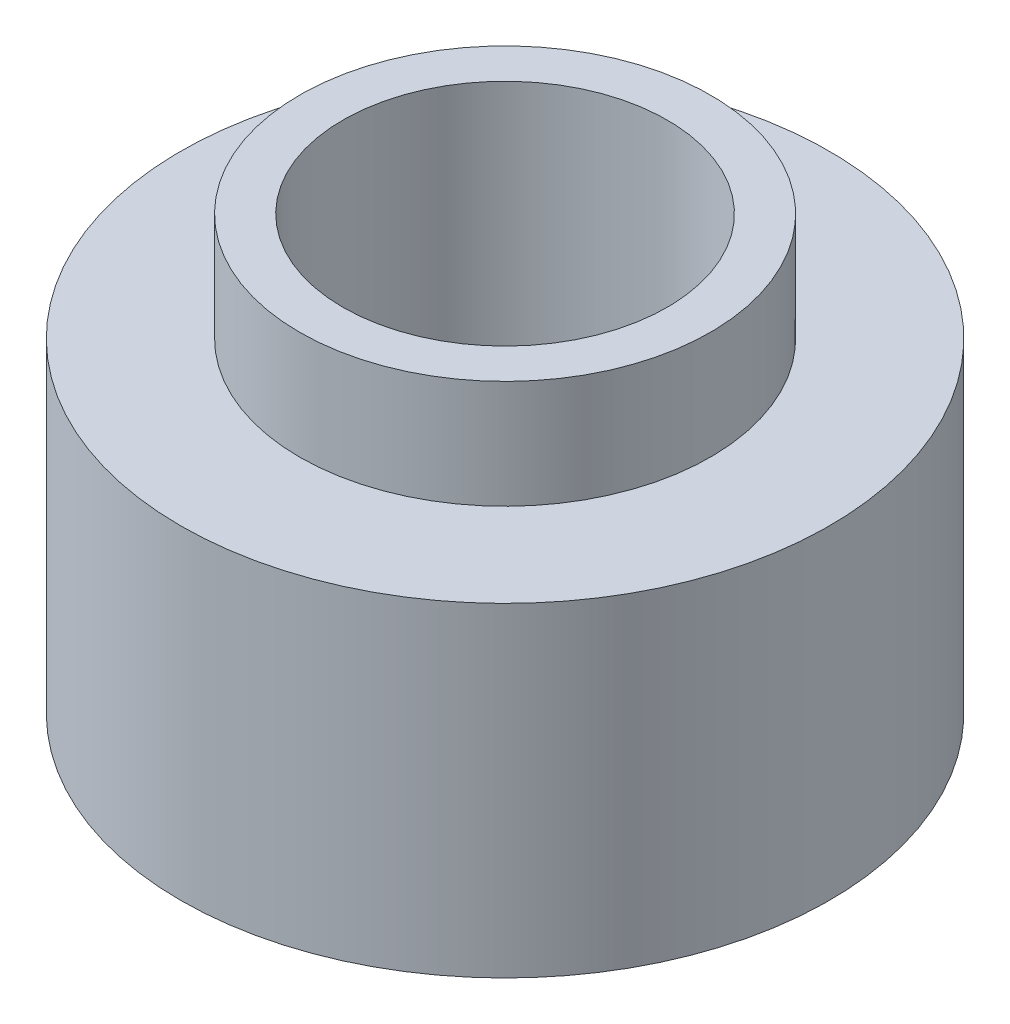
ISO-10303-21;
HEADER;
FILE_DESCRIPTION(('STEP AP214'),'2;1');
FILE_NAME('part.step','',(''),(''),'','','');
FILE_SCHEMA(('AUTOMOTIVE_DESIGN { 1 0 10303 214 1 1 1 1 }'));
ENDSEC;
DATA;
#1=APPLICATION_CONTEXT('core data for automotive mechanical design processes');
#2=APPLICATION_PROTOCOL_DEFINITION('international standard','automotive_design',2000,#1);
#3=PRODUCT_CONTEXT('',#1,'mechanical');
#4=PRODUCT('Part','Part','',(#3));
#5=PRODUCT_RELATED_PRODUCT_CATEGORY('part','',(#4));
#6=PRODUCT_DEFINITION_FORMATION('','',#4);
#7=PRODUCT_DEFINITION_CONTEXT('part definition',#1,'design');
#8=PRODUCT_DEFINITION('design','',#6,#7);
#9=PRODUCT_DEFINITION_SHAPE('','',#8);
#10=(LENGTH_UNIT() NAMED_UNIT(*) SI_UNIT(.MILLI.,.METRE.));
#11=(NAMED_UNIT(*) PLANE_ANGLE_UNIT() SI_UNIT($,.RADIAN.));
#12=(NAMED_UNIT(*) SI_UNIT($,.STERADIAN.) SOLID_ANGLE_UNIT());
#13=UNCERTAINTY_MEASURE_WITH_UNIT(LENGTH_MEASURE(1.E-05),#10,'distance_accuracy_value','');
#14=(GEOMETRIC_REPRESENTATION_CONTEXT(3) GLOBAL_UNCERTAINTY_ASSIGNED_CONTEXT((#13)) GLOBAL_UNIT_ASSIGNED_CONTEXT((#10,
#11,#12)) REPRESENTATION_CONTEXT('',''));
#15=CARTESIAN_POINT('',(0.,0.,0.));
#16=DIRECTION('',(0.,0.,1.));
#17=DIRECTION('',(1.,0.,0.));
#18=AXIS2_PLACEMENT_3D('',#15,#16,#17);
#19=CARTESIAN_POINT('',(0.,0.375,0.));
#20=DIRECTION('',(0.,-1.,0.));
#21=DIRECTION('',(0.,0.,-1.));
#22=AXIS2_PLACEMENT_3D('',#19,#20,#21);
#23=CYLINDRICAL_SURFACE('',#22,0.375);
#24=CARTESIAN_POINT('',(0.,0.375,0.));
#25=DIRECTION('',(0.,1.,0.));
#26=DIRECTION('',(0.,0.,1.));
#27=AXIS2_PLACEMENT_3D('',#24,#25,#26);
#28=CIRCLE('',#27,0.375);
#29=CARTESIAN_POINT('',(0.,0.375,0.375));
#30=VERTEX_POINT('',#29);
#31=EDGE_CURVE('E10',#30,#30,#28,.T.);
#32=ORIENTED_EDGE('',*,*,#31,.F.);
#33=EDGE_LOOP('',(#32));
#34=FACE_BOUND('',#33,.T.);
#35=CARTESIAN_POINT('',(0.,0.,0.));
#36=DIRECTION('',(0.,1.,0.));
#37=DIRECTION('',(0.,0.,1.));
#38=AXIS2_PLACEMENT_3D('',#35,#36,#37);
#39=CIRCLE('',#38,0.375);
#40=CARTESIAN_POINT('',(0.,0.,0.375));
#41=VERTEX_POINT('',#40);
#42=EDGE_CURVE('E40',#41,#41,#39,.T.);
#43=ORIENTED_EDGE('',*,*,#42,.T.);
#44=EDGE_LOOP('',(#43));
#45=FACE_BOUND('',#44,.T.);
#46=ADVANCED_FACE('F37',(#34,#45),#23,.T.);
#47=CARTESIAN_POINT('',(0.,0.375,0.));
#48=DIRECTION('',(0.,1.,0.));
#49=DIRECTION('',(0.,0.,1.));
#50=AXIS2_PLACEMENT_3D('',#47,#48,#49);
#51=PLANE('',#50);
#52=CARTESIAN_POINT('',(0.,0.375,0.));
#53=DIRECTION('',(0.,1.,0.));
#54=DIRECTION('',(0.,0.,1.));
#55=AXIS2_PLACEMENT_3D('',#52,#53,#54);
#56=CIRCLE('',#55,0.2375);
#57=CARTESIAN_POINT('',(0.,0.375,0.2375));
#58=VERTEX_POINT('',#57);
#59=EDGE_CURVE('E55',#58,#58,#56,.T.);
#60=ORIENTED_EDGE('',*,*,#59,.F.);
#61=EDGE_LOOP('',(#60));
#62=FACE_BOUND('',#61,.T.);
#63=ORIENTED_EDGE('',*,*,#31,.T.);
#64=EDGE_LOOP('',(#63));
#65=FACE_BOUND('',#64,.T.);
#66=ADVANCED_FACE('F81',(#62,#65),#51,.T.);
#67=CARTESIAN_POINT('',(0.,0.,0.));
#68=DIRECTION('',(0.,1.,0.));
#69=DIRECTION('',(0.,0.,1.));
#70=AXIS2_PLACEMENT_3D('',#67,#68,#69);
#71=PLANE('',#70);
#72=CARTESIAN_POINT('',(0.,0.,0.));
#73=DIRECTION('',(0.,1.,0.));
#74=DIRECTION('',(0.,0.,1.));
#75=AXIS2_PLACEMENT_3D('',#72,#73,#74);
#76=CIRCLE('',#75,0.1875);
#77=CARTESIAN_POINT('',(0.,0.,0.1875));
#78=VERTEX_POINT('',#77);
#79=EDGE_CURVE('E49',#78,#78,#76,.T.);
#80=ORIENTED_EDGE('',*,*,#79,.T.);
#81=EDGE_LOOP('',(#80));
#82=FACE_BOUND('',#81,.T.);
#83=ORIENTED_EDGE('',*,*,#42,.F.);
#84=EDGE_LOOP('',(#83));
#85=FACE_BOUND('',#84,.T.);
#86=ADVANCED_FACE('F83',(#82,#85),#71,.F.);
#87=CARTESIAN_POINT('',(0.,0.,0.));
#88=DIRECTION('',(0.,1.,0.));
#89=DIRECTION('',(0.,0.,1.));
#90=AXIS2_PLACEMENT_3D('',#87,#88,#89);
#91=CYLINDRICAL_SURFACE('',#90,0.1875);
#92=ORIENTED_EDGE('',*,*,#79,.F.);
#93=EDGE_LOOP('',(#92));
#94=FACE_BOUND('',#93,.T.);
#95=CARTESIAN_POINT('',(0.,0.5,0.));
#96=DIRECTION('',(0.,1.,0.));
#97=DIRECTION('',(0.,0.,1.));
#98=AXIS2_PLACEMENT_3D('',#95,#96,#97);
#99=CIRCLE('',#98,0.1875);
#100=CARTESIAN_POINT('',(0.,0.5,0.1875));
#101=VERTEX_POINT('',#100);
#102=EDGE_CURVE('E59',#101,#101,#99,.T.);
#103=ORIENTED_EDGE('',*,*,#102,.T.);
#104=EDGE_LOOP('',(#103));
#105=FACE_BOUND('',#104,.T.);
#106=ADVANCED_FACE('F67',(#94,#105),#91,.F.);
#107=CARTESIAN_POINT('',(0.,0.5,0.));
#108=DIRECTION('',(0.,-1.,0.));
#109=DIRECTION('',(0.,0.,-1.));
#110=AXIS2_PLACEMENT_3D('',#107,#108,#109);
#111=CYLINDRICAL_SURFACE('',#110,0.2375);
#112=CARTESIAN_POINT('',(0.,0.5,0.));
#113=DIRECTION('',(0.,1.,0.));
#114=DIRECTION('',(0.,0.,1.));
#115=AXIS2_PLACEMENT_3D('',#112,#113,#114);
#116=CIRCLE('',#115,0.2375);
#117=CARTESIAN_POINT('',(0.,0.5,0.2375));
#118=VERTEX_POINT('',#117);
#119=EDGE_CURVE('E54',#118,#118,#116,.T.);
#120=ORIENTED_EDGE('',*,*,#119,.F.);
#121=EDGE_LOOP('',(#120));
#122=FACE_BOUND('',#121,.T.);
#123=ORIENTED_EDGE('',*,*,#59,.T.);
#124=EDGE_LOOP('',(#123));
#125=FACE_BOUND('',#124,.T.);
#126=ADVANCED_FACE('F72',(#122,#125),#111,.T.);
#127=CARTESIAN_POINT('',(0.,0.5,0.));
#128=DIRECTION('',(0.,1.,0.));
#129=DIRECTION('',(0.,0.,1.));
#130=AXIS2_PLACEMENT_3D('',#127,#128,#129);
#131=PLANE('',#130);
#132=ORIENTED_EDGE('',*,*,#102,.F.);
#133=EDGE_LOOP('',(#132));
#134=FACE_BOUND('',#133,.T.);
#135=ORIENTED_EDGE('',*,*,#119,.T.);
#136=EDGE_LOOP('',(#135));
#137=FACE_BOUND('',#136,.T.);
#138=ADVANCED_FACE('F69',(#134,#137),#131,.T.);
#139=CLOSED_SHELL('',(#46,#66,#86,#106,#126,#138));
#140=MANIFOLD_SOLID_BREP('B2',#139);
#141=ADVANCED_BREP_SHAPE_REPRESENTATION('',(#18,#140),#14);
#142=SHAPE_DEFINITION_REPRESENTATION(#9,#141);
ENDSEC;
END-ISO-10303-21;
